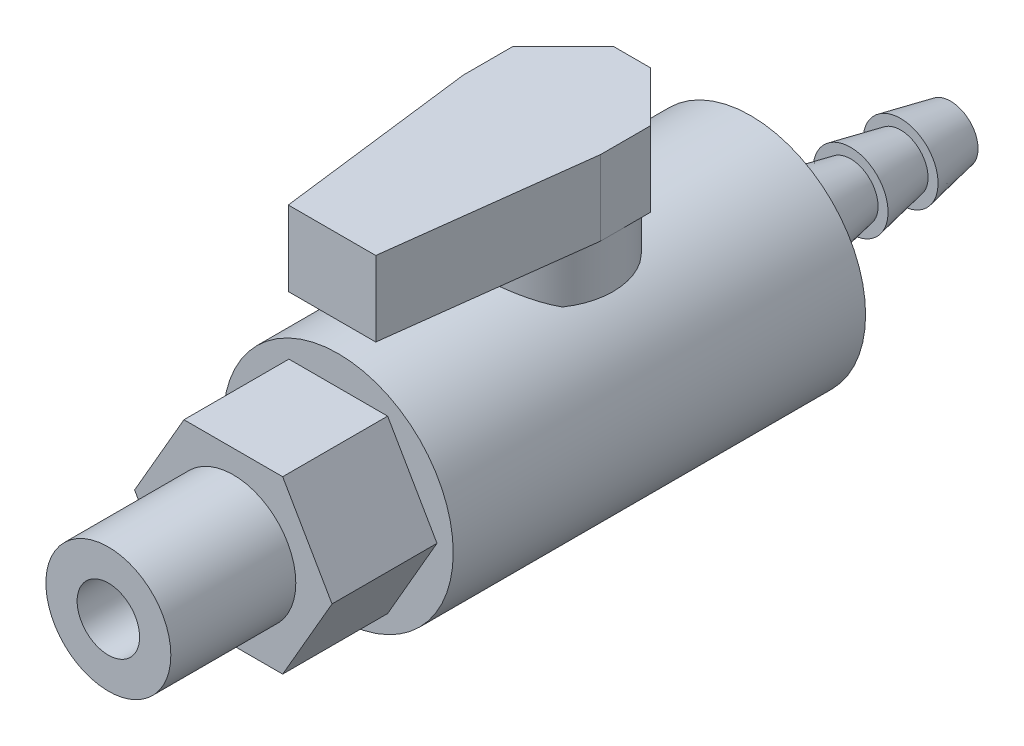
ISO-10303-21;
HEADER;
FILE_DESCRIPTION(('STEP AP214'),'2;1');
FILE_NAME('part.step','',(''),(''),'','','');
FILE_SCHEMA(('AUTOMOTIVE_DESIGN { 1 0 10303 214 1 1 1 1 }'));
ENDSEC;
DATA;
#1=APPLICATION_CONTEXT('core data for automotive mechanical design processes');
#2=APPLICATION_PROTOCOL_DEFINITION('international standard','automotive_design',2000,#1);
#3=PRODUCT_CONTEXT('',#1,'mechanical');
#4=PRODUCT('Part','Part','',(#3));
#5=PRODUCT_RELATED_PRODUCT_CATEGORY('part','',(#4));
#6=PRODUCT_DEFINITION_FORMATION('','',#4);
#7=PRODUCT_DEFINITION_CONTEXT('part definition',#1,'design');
#8=PRODUCT_DEFINITION('design','',#6,#7);
#9=PRODUCT_DEFINITION_SHAPE('','',#8);
#10=(LENGTH_UNIT() NAMED_UNIT(*) SI_UNIT(.MILLI.,.METRE.));
#11=(NAMED_UNIT(*) PLANE_ANGLE_UNIT() SI_UNIT($,.RADIAN.));
#12=(NAMED_UNIT(*) SI_UNIT($,.STERADIAN.) SOLID_ANGLE_UNIT());
#13=UNCERTAINTY_MEASURE_WITH_UNIT(LENGTH_MEASURE(1.E-05),#10,'distance_accuracy_value','');
#14=(GEOMETRIC_REPRESENTATION_CONTEXT(3) GLOBAL_UNCERTAINTY_ASSIGNED_CONTEXT((#13)) GLOBAL_UNIT_ASSIGNED_CONTEXT((#10,
#11,#12)) REPRESENTATION_CONTEXT('',''));
#15=CARTESIAN_POINT('',(0.,0.,0.));
#16=DIRECTION('',(0.,0.,1.));
#17=DIRECTION('',(1.,0.,0.));
#18=AXIS2_PLACEMENT_3D('',#15,#16,#17);
#19=CARTESIAN_POINT('',(0.,0.,0.));
#20=DIRECTION('',(0.,0.,1.));
#21=DIRECTION('',(1.,0.,0.));
#22=AXIS2_PLACEMENT_3D('',#19,#20,#21);
#23=CYLINDRICAL_SURFACE('',#22,11.684);
#24=CARTESIAN_POINT('',(0.,0.,-65.278));
#25=DIRECTION('',(0.,0.,1.));
#26=DIRECTION('',(1.,0.,0.));
#27=AXIS2_PLACEMENT_3D('',#24,#25,#26);
#28=CIRCLE('',#27,11.684);
#29=CARTESIAN_POINT('',(11.684,0.,-65.278));
#30=VERTEX_POINT('',#29);
#31=EDGE_CURVE('E332',#30,#30,#28,.T.);
#32=ORIENTED_EDGE('',*,*,#31,.T.);
#33=EDGE_LOOP('',(#32));
#34=FACE_BOUND('',#33,.T.);
#35=CARTESIAN_POINT('',(0.,0.,-23.368));
#36=DIRECTION('',(0.,0.,1.));
#37=DIRECTION('',(1.,0.,0.));
#38=AXIS2_PLACEMENT_3D('',#35,#36,#37);
#39=CIRCLE('',#38,11.684);
#40=CARTESIAN_POINT('',(11.684,0.,-23.368));
#41=VERTEX_POINT('',#40);
#42=EDGE_CURVE('E328',#41,#41,#39,.T.);
#43=ORIENTED_EDGE('',*,*,#42,.F.);
#44=EDGE_LOOP('',(#43));
#45=FACE_BOUND('',#44,.T.);
#46=CARTESIAN_POINT('',(5.76977087933308,10.16,-40.386));
#47=CARTESIAN_POINT('',(5.65632892103498,10.2244365039873,-40.2197733986789));
#48=CARTESIAN_POINT('',(5.535985553232,10.290253133912,-40.0588133135757));
#49=CARTESIAN_POINT('',(5.2820805201733,10.4228555277688,-39.7480494852985));
#50=CARTESIAN_POINT('',(5.14851635970885,10.4896414726058,-39.5982478574866));
#51=CARTESIAN_POINT('',(4.86795890366655,10.6227636111253,-39.3096247789162));
#52=CARTESIAN_POINT('',(4.72088987833321,10.6890947058936,-39.1708745623798));
#53=CARTESIAN_POINT('',(4.41461789528448,10.8191809507555,-38.9061426237816));
#54=CARTESIAN_POINT('',(4.25541547643622,10.8829362150544,-38.7801603352498));
#55=CARTESIAN_POINT('',(3.92513471056836,11.0063767668538,-38.5415516577204));
#56=CARTESIAN_POINT('',(3.75402777695614,11.0660515237928,-38.4289593092986));
#57=CARTESIAN_POINT('',(3.40114445381335,11.1795533084468,-38.2185236843708));
#58=CARTESIAN_POINT('',(3.21936953363,11.2333811385859,-38.1206783832843));
#59=CARTESIAN_POINT('',(2.84664533285514,11.3335612304382,-37.9410312545628));
#60=CARTESIAN_POINT('',(2.65571954599307,11.3799314307606,-37.8591908230467));
#61=CARTESIAN_POINT('',(2.26564173196638,11.4639655042644,-37.712364516591));
#62=CARTESIAN_POINT('',(2.06649082584244,11.5016305593261,-37.6473763535062));
#63=CARTESIAN_POINT('',(1.67981445420393,11.5641223539297,-37.5403009053585));
#64=CARTESIAN_POINT('',(1.49284988261245,11.5897979641735,-37.4966817016675));
#65=CARTESIAN_POINT('',(1.11497726262205,11.6322316969521,-37.4248825145993));
#66=CARTESIAN_POINT('',(0.924069442431034,11.6489903340458,-37.3967016403421));
#67=CARTESIAN_POINT('',(0.540012813834256,11.6730997779217,-37.3562294705955));
#68=CARTESIAN_POINT('',(0.346864339587791,11.6804519697844,-37.3439358357388));
#69=CARTESIAN_POINT('',(-0.0399059236029485,11.6855318642589,-37.3354369217093));
#70=CARTESIAN_POINT('',(-0.233527670902482,11.6832603852317,-37.3392302745592));
#71=CARTESIAN_POINT('',(-0.597162230984426,11.6699806849551,-37.3614713257114));
#72=CARTESIAN_POINT('',(-0.76732308824445,11.6600100252604,-37.3781789187424));
#73=CARTESIAN_POINT('',(-1.10545241660286,11.6328244074311,-37.423919466847));
#74=CARTESIAN_POINT('',(-1.27342014220378,11.6156070488379,-37.45295650606));
#75=CARTESIAN_POINT('',(-1.60585866269001,11.5743299407636,-37.5229793545471));
#76=CARTESIAN_POINT('',(-1.77033177199984,11.5502748818628,-37.5639569732093));
#77=CARTESIAN_POINT('',(-2.09495476586274,11.4958307325327,-37.6574216172769));
#78=CARTESIAN_POINT('',(-2.25510302437801,11.4654392962229,-37.7099129056975));
#79=CARTESIAN_POINT('',(-2.57282179030345,11.3983874394136,-37.8268518101939));
#80=CARTESIAN_POINT('',(-2.73030288088384,11.361629679152,-37.8914866399702));
#81=CARTESIAN_POINT('',(-3.03909783989209,11.2829599476861,-38.0315060363963));
#82=CARTESIAN_POINT('',(-3.19040912474286,11.2410458462086,-38.1068950480581));
#83=CARTESIAN_POINT('',(-3.63440250504843,11.1086519277036,-38.3484888982689));
#84=CARTESIAN_POINT('',(-3.91700349008683,11.0115512575821,-38.530068241325));
#85=CARTESIAN_POINT('',(-4.33852801805006,10.8499161377072,-38.8453294143044));
#86=CARTESIAN_POINT('',(-4.4879731343829,10.7888178607245,-38.9671287242744));
#87=CARTESIAN_POINT('',(-4.77588910160909,10.6644867904766,-39.2222104101614));
#88=CARTESIAN_POINT('',(-4.91435811103413,10.6012536415694,-39.3554947051261));
#89=CARTESIAN_POINT('',(-5.17937476522111,10.4743241855835,-39.6324797878919));
#90=CARTESIAN_POINT('',(-5.30595198725609,10.4106294762125,-39.7761530695832));
#91=CARTESIAN_POINT('',(-5.54703319730987,10.2842040957948,-40.0736197493284));
#92=CARTESIAN_POINT('',(-5.66154035576268,10.2214731753072,-40.2274104725178));
#93=CARTESIAN_POINT('',(-5.76977087933308,10.16,-40.386));
#94=B_SPLINE_CURVE_WITH_KNOTS('',3,(#46,#47,#48,#49,#50,#51,#52,#53,#54,#55,#56,#57,#58,#59,#60,
#61,#62,#63,#64,#65,#66,#67,#68,#69,#70,#71,#72,#73,#74,#75,#76,#77,#78,#79,#80,#81,#82,#83,#84,
#85,#86,#87,#88,#89,#90,#91,#92,#93),.UNSPECIFIED.,.F.,.F.,(4,2,2,2,2,2,2,2,2,2,2,2,2,2,2,2,2,2,
2,2,2,2,2,4),(0.,0.633729082642627,1.26757800018408,1.90522804188353,2.54284978081293,
3.18205934759029,3.82118107899849,4.45874169713029,5.09621570401146,5.67647366460667,
6.25669813746281,6.83683716357289,7.41692685781365,7.93013108717144,8.44350544864802,
8.95652848785708,9.46974179896653,9.99163566356327,10.5137458702914,11.5584212715623,
12.1646438906745,12.7709680018142,13.3757417590476,13.9803562628952),.UNSPECIFIED.);
#95=CARTESIAN_POINT('',(5.76977087933308,10.16,-40.386));
#96=VERTEX_POINT('',#95);
#97=CARTESIAN_POINT('',(-5.76977087933308,10.16,-40.386));
#98=VERTEX_POINT('',#97);
#99=EDGE_CURVE('E354',#96,#98,#94,.T.);
#100=ORIENTED_EDGE('',*,*,#99,.T.);
#101=DIRECTION('',(0.,0.,1.));
#102=VECTOR('',#101,1.);
#103=CARTESIAN_POINT('',(-5.76977087933308,10.16,0.));
#104=LINE('',#103,#102);
#105=CARTESIAN_POINT('',(-5.76977087933308,10.16,-48.26));
#106=VERTEX_POINT('',#105);
#107=EDGE_CURVE('E457',#98,#106,#104,.F.);
#108=ORIENTED_EDGE('',*,*,#107,.T.);
#109=CARTESIAN_POINT('',(-5.76977087933308,10.16,-48.26));
#110=CARTESIAN_POINT('',(-5.65632892103498,10.2244365039873,-48.4262266013211));
#111=CARTESIAN_POINT('',(-5.53598555323201,10.290253133912,-48.5871866864243));
#112=CARTESIAN_POINT('',(-5.28208052017331,10.4228555277688,-48.8979505147015));
#113=CARTESIAN_POINT('',(-5.14851635970885,10.4896414726058,-49.0477521425134));
#114=CARTESIAN_POINT('',(-4.86795890366655,10.6227636111253,-49.3363752210838));
#115=CARTESIAN_POINT('',(-4.72088987833321,10.6890947058936,-49.4751254376202));
#116=CARTESIAN_POINT('',(-4.41461789528448,10.8191809507555,-49.7398573762185));
#117=CARTESIAN_POINT('',(-4.25541547643622,10.8829362150544,-49.8658396647502));
#118=CARTESIAN_POINT('',(-3.92513471056836,11.0063767668538,-50.1044483422796));
#119=CARTESIAN_POINT('',(-3.75402777695614,11.0660515237928,-50.2170406907014));
#120=CARTESIAN_POINT('',(-3.40114445381335,11.1795533084468,-50.4274763156292));
#121=CARTESIAN_POINT('',(-3.21936953363,11.2333811385859,-50.5253216167157));
#122=CARTESIAN_POINT('',(-2.84664533285514,11.3335612304382,-50.7049687454372));
#123=CARTESIAN_POINT('',(-2.65571954599307,11.3799314307606,-50.7868091769533));
#124=CARTESIAN_POINT('',(-2.26564173196638,11.4639655042644,-50.933635483409));
#125=CARTESIAN_POINT('',(-2.06649082584244,11.5016305593261,-50.9986236464938));
#126=CARTESIAN_POINT('',(-1.67981445420393,11.5641223539297,-51.1056990946415));
#127=CARTESIAN_POINT('',(-1.49284988261245,11.5897979641735,-51.1493182983325));
#128=CARTESIAN_POINT('',(-1.11497726262205,11.6322316969521,-51.2211174854007));
#129=CARTESIAN_POINT('',(-0.924069442431032,11.6489903340458,-51.2492983596579));
#130=CARTESIAN_POINT('',(-0.540012813834255,11.6730997779217,-51.2897705294045));
#131=CARTESIAN_POINT('',(-0.34686433958779,11.6804519697844,-51.3020641642612));
#132=CARTESIAN_POINT('',(0.0399059236029493,11.6855318642589,-51.3105630782907));
#133=CARTESIAN_POINT('',(0.233527670902482,11.6832603852317,-51.3067697254409));
#134=CARTESIAN_POINT('',(0.597162230984427,11.6699806849551,-51.2845286742886));
#135=CARTESIAN_POINT('',(0.76732308824445,11.6600100252604,-51.2678210812576));
#136=CARTESIAN_POINT('',(1.10545241660286,11.6328244074311,-51.222080533153));
#137=CARTESIAN_POINT('',(1.27342014220378,11.6156070488379,-51.19304349394));
#138=CARTESIAN_POINT('',(1.60585866269001,11.5743299407636,-51.1230206454529));
#139=CARTESIAN_POINT('',(1.77033177199984,11.5502748818628,-51.0820430267907));
#140=CARTESIAN_POINT('',(2.09495476586274,11.4958307325327,-50.9885783827231));
#141=CARTESIAN_POINT('',(2.25510302437801,11.4654392962229,-50.9360870943025));
#142=CARTESIAN_POINT('',(2.57282179030345,11.3983874394136,-50.8191481898061));
#143=CARTESIAN_POINT('',(2.73030288088384,11.361629679152,-50.7545133600298));
#144=CARTESIAN_POINT('',(3.03909783989209,11.2829599476861,-50.6144939636037));
#145=CARTESIAN_POINT('',(3.19040912474286,11.2410458462086,-50.5391049519419));
#146=CARTESIAN_POINT('',(3.63440250504843,11.1086519277036,-50.2975111017311));
#147=CARTESIAN_POINT('',(3.91700349008683,11.0115512575821,-50.115931758675));
#148=CARTESIAN_POINT('',(4.33852801805007,10.8499161377072,-49.8006705856956));
#149=CARTESIAN_POINT('',(4.4879731343829,10.7888178607245,-49.6788712757256));
#150=CARTESIAN_POINT('',(4.77588910160909,10.6644867904766,-49.4237895898386));
#151=CARTESIAN_POINT('',(4.91435811103413,10.6012536415694,-49.290505294874));
#152=CARTESIAN_POINT('',(5.17937476522111,10.4743241855835,-49.0135202121081));
#153=CARTESIAN_POINT('',(5.30595198725609,10.4106294762125,-48.8698469304168));
#154=CARTESIAN_POINT('',(5.54703319730987,10.2842040957948,-48.5723802506716));
#155=CARTESIAN_POINT('',(5.66154035576268,10.2214731753072,-48.4185895274822));
#156=CARTESIAN_POINT('',(5.76977087933308,10.16,-48.26));
#157=B_SPLINE_CURVE_WITH_KNOTS('',3,(#109,#110,#111,#112,#113,#114,#115,#116,#117,#118,#119,
#120,#121,#122,#123,#124,#125,#126,#127,#128,#129,#130,#131,#132,#133,#134,#135,#136,#137,#138,
#139,#140,#141,#142,#143,#144,#145,#146,#147,#148,#149,#150,#151,#152,#153,#154,#155,#156),
.UNSPECIFIED.,.F.,.F.,(4,2,2,2,2,2,2,2,2,2,2,2,2,2,2,2,2,2,2,2,2,2,2,4),(0.,0.633729082642625,
1.26757800018408,1.90522804188353,2.54284978081293,3.18205934759029,3.82118107899849,
4.45874169713029,5.09621570401146,5.67647366460667,6.25669813746281,6.83683716357289,
7.41692685781365,7.93013108717144,8.44350544864802,8.95652848785708,9.46974179896653,
9.99163566356327,10.5137458702914,11.5584212715623,12.1646438906745,12.7709680018142,
13.3757417590476,13.9803562628952),.UNSPECIFIED.);
#158=CARTESIAN_POINT('',(5.76977087933308,10.16,-48.26));
#159=VERTEX_POINT('',#158);
#160=EDGE_CURVE('E344',#106,#159,#157,.T.);
#161=ORIENTED_EDGE('',*,*,#160,.T.);
#162=DIRECTION('',(0.,0.,1.));
#163=VECTOR('',#162,1.);
#164=CARTESIAN_POINT('',(5.76977087933308,10.16,0.));
#165=LINE('',#164,#163);
#166=EDGE_CURVE('E340',#159,#96,#165,.T.);
#167=ORIENTED_EDGE('',*,*,#166,.T.);
#168=EDGE_LOOP('',(#100,#108,#161,#167));
#169=FACE_BOUND('',#168,.T.);
#170=ADVANCED_FACE('F45',(#34,#45,#169),#23,.T.);
#171=CARTESIAN_POINT('',(10.16,0.,-12.7));
#172=DIRECTION('',(0.,0.,1.));
#173=DIRECTION('',(1.,0.,0.));
#174=AXIS2_PLACEMENT_3D('',#171,#172,#173);
#175=PLANE('',#174);
#176=CARTESIAN_POINT('',(0.,0.,-12.7));
#177=DIRECTION('',(0.,0.,1.));
#178=DIRECTION('',(1.,0.,0.));
#179=AXIS2_PLACEMENT_3D('',#176,#177,#178);
#180=CIRCLE('',#179,6.35);
#181=CARTESIAN_POINT('',(6.35,0.,-12.7));
#182=VERTEX_POINT('',#181);
#183=EDGE_CURVE('E324',#182,#182,#180,.T.);
#184=ORIENTED_EDGE('',*,*,#183,.F.);
#185=EDGE_LOOP('',(#184));
#186=FACE_BOUND('',#185,.T.);
#187=DIRECTION('',(1.,0.,0.));
#188=VECTOR('',#187,1.);
#189=CARTESIAN_POINT('',(-5.01649999999999,-8.68883287616927,-12.7));
#190=LINE('',#189,#188);
#191=CARTESIAN_POINT('',(-5.01649999999999,-8.68883287616927,-12.7));
#192=VERTEX_POINT('',#191);
#193=CARTESIAN_POINT('',(5.0165,-8.68883287616927,-12.7));
#194=VERTEX_POINT('',#193);
#195=EDGE_CURVE('E194',#192,#194,#190,.T.);
#196=ORIENTED_EDGE('',*,*,#195,.T.);
#197=DIRECTION('',(0.5,0.866025403784439,0.));
#198=VECTOR('',#197,1.);
#199=CARTESIAN_POINT('',(5.0165,-8.68883287616927,-12.7));
#200=LINE('',#199,#198);
#201=CARTESIAN_POINT('',(10.033,0.,-12.7));
#202=VERTEX_POINT('',#201);
#203=EDGE_CURVE('E243',#194,#202,#200,.T.);
#204=ORIENTED_EDGE('',*,*,#203,.T.);
#205=DIRECTION('',(-0.5,0.866025403784439,0.));
#206=VECTOR('',#205,1.);
#207=CARTESIAN_POINT('',(10.033,0.,-12.7));
#208=LINE('',#207,#206);
#209=CARTESIAN_POINT('',(5.0165,8.68883287616927,-12.7));
#210=VERTEX_POINT('',#209);
#211=EDGE_CURVE('E247',#202,#210,#208,.T.);
#212=ORIENTED_EDGE('',*,*,#211,.T.);
#213=DIRECTION('',(-1.,0.,0.));
#214=VECTOR('',#213,1.);
#215=CARTESIAN_POINT('',(5.0165,8.68883287616927,-12.7));
#216=LINE('',#215,#214);
#217=CARTESIAN_POINT('',(-5.01649999999999,8.68883287616927,-12.7));
#218=VERTEX_POINT('',#217);
#219=EDGE_CURVE('E251',#210,#218,#216,.T.);
#220=ORIENTED_EDGE('',*,*,#219,.T.);
#221=DIRECTION('',(-0.5,-0.866025403784439,0.));
#222=VECTOR('',#221,1.);
#223=CARTESIAN_POINT('',(-5.01649999999999,8.68883287616927,-12.7));
#224=LINE('',#223,#222);
#225=CARTESIAN_POINT('',(-10.033,0.,-12.7));
#226=VERTEX_POINT('',#225);
#227=EDGE_CURVE('E255',#218,#226,#224,.T.);
#228=ORIENTED_EDGE('',*,*,#227,.T.);
#229=DIRECTION('',(0.5,-0.866025403784439,0.));
#230=VECTOR('',#229,1.);
#231=CARTESIAN_POINT('',(-10.033,0.,-12.7));
#232=LINE('',#231,#230);
#233=EDGE_CURVE('E259',#226,#192,#232,.T.);
#234=ORIENTED_EDGE('',*,*,#233,.T.);
#235=EDGE_LOOP('',(#196,#204,#212,#220,#228,#234));
#236=FACE_BOUND('',#235,.T.);
#237=ADVANCED_FACE('F433',(#186,#236),#175,.T.);
#238=CARTESIAN_POINT('',(0.,0.,0.));
#239=DIRECTION('',(0.,0.,1.));
#240=DIRECTION('',(1.,0.,0.));
#241=AXIS2_PLACEMENT_3D('',#238,#239,#240);
#242=CYLINDRICAL_SURFACE('',#241,3.81);
#243=CARTESIAN_POINT('',(0.,0.,-65.278));
#244=DIRECTION('',(0.,0.,1.));
#245=DIRECTION('',(1.,0.,0.));
#246=AXIS2_PLACEMENT_3D('',#243,#244,#245);
#247=CIRCLE('',#246,3.81);
#248=CARTESIAN_POINT('',(3.81,0.,-65.278));
#249=VERTEX_POINT('',#248);
#250=EDGE_CURVE('E336',#249,#249,#247,.T.);
#251=ORIENTED_EDGE('',*,*,#250,.F.);
#252=EDGE_LOOP('',(#251));
#253=FACE_BOUND('',#252,.T.);
#254=CARTESIAN_POINT('',(0.,0.,-70.358));
#255=DIRECTION('',(0.,0.,-1.));
#256=DIRECTION('',(-1.,0.,0.));
#257=AXIS2_PLACEMENT_3D('',#254,#255,#256);
#258=CIRCLE('',#257,3.81);
#259=CARTESIAN_POINT('',(-3.81,0.,-70.358));
#260=VERTEX_POINT('',#259);
#261=EDGE_CURVE('E222',#260,#260,#258,.T.);
#262=ORIENTED_EDGE('',*,*,#261,.F.);
#263=EDGE_LOOP('',(#262));
#264=FACE_BOUND('',#263,.T.);
#265=ADVANCED_FACE('F435',(#253,#264),#242,.T.);
#266=CARTESIAN_POINT('',(1.905,0.,-85.598));
#267=DIRECTION('',(0.,0.,-1.));
#268=DIRECTION('',(-1.,0.,0.));
#269=AXIS2_PLACEMENT_3D('',#266,#267,#268);
#270=PLANE('',#269);
#271=CARTESIAN_POINT('',(0.,0.,-85.598));
#272=DIRECTION('',(0.,0.,1.));
#273=DIRECTION('',(1.,0.,0.));
#274=AXIS2_PLACEMENT_3D('',#271,#272,#273);
#275=CIRCLE('',#274,1.905);
#276=CARTESIAN_POINT('',(1.905,0.,-85.598));
#277=VERTEX_POINT('',#276);
#278=EDGE_CURVE('E308',#277,#277,#275,.T.);
#279=ORIENTED_EDGE('',*,*,#278,.T.);
#280=EDGE_LOOP('',(#279));
#281=FACE_BOUND('',#280,.T.);
#282=CARTESIAN_POINT('',(0.,0.,-85.598));
#283=DIRECTION('',(0.,0.,-1.));
#284=DIRECTION('',(-1.,0.,0.));
#285=AXIS2_PLACEMENT_3D('',#282,#283,#284);
#286=CIRCLE('',#285,2.79399999999999);
#287=CARTESIAN_POINT('',(-2.79399999999999,0.,-85.598));
#288=VERTEX_POINT('',#287);
#289=EDGE_CURVE('E304',#288,#288,#286,.T.);
#290=ORIENTED_EDGE('',*,*,#289,.T.);
#291=EDGE_LOOP('',(#290));
#292=FACE_BOUND('',#291,.T.);
#293=ADVANCED_FACE('F443',(#281,#292),#270,.T.);
#294=CARTESIAN_POINT('',(3.81,0.,-65.278));
#295=DIRECTION('',(0.,0.,-1.));
#296=DIRECTION('',(-1.,0.,0.));
#297=AXIS2_PLACEMENT_3D('',#294,#295,#296);
#298=PLANE('',#297);
#299=ORIENTED_EDGE('',*,*,#250,.T.);
#300=EDGE_LOOP('',(#299));
#301=FACE_BOUND('',#300,.T.);
#302=ORIENTED_EDGE('',*,*,#31,.F.);
#303=EDGE_LOOP('',(#302));
#304=FACE_BOUND('',#303,.T.);
#305=ADVANCED_FACE('F438',(#301,#304),#298,.T.);
#306=CARTESIAN_POINT('',(11.684,0.,-23.368));
#307=DIRECTION('',(0.,0.,1.));
#308=DIRECTION('',(1.,0.,0.));
#309=AXIS2_PLACEMENT_3D('',#306,#307,#308);
#310=PLANE('',#309);
#311=ORIENTED_EDGE('',*,*,#42,.T.);
#312=EDGE_LOOP('',(#311));
#313=FACE_BOUND('',#312,.T.);
#314=DIRECTION('',(-0.5,-0.866025403784439,0.));
#315=VECTOR('',#314,1.);
#316=CARTESIAN_POINT('',(5.0165,-8.68883287616927,-23.368));
#317=LINE('',#316,#315);
#318=CARTESIAN_POINT('',(10.033,0.,-23.368));
#319=VERTEX_POINT('',#318);
#320=CARTESIAN_POINT('',(5.0165,-8.68883287616927,-23.368));
#321=VERTEX_POINT('',#320);
#322=EDGE_CURVE('E239',#319,#321,#317,.T.);
#323=ORIENTED_EDGE('',*,*,#322,.T.);
#324=DIRECTION('',(-1.,0.,0.));
#325=VECTOR('',#324,1.);
#326=CARTESIAN_POINT('',(-5.01649999999999,-8.68883287616927,-23.368));
#327=LINE('',#326,#325);
#328=CARTESIAN_POINT('',(-5.01649999999999,-8.68883287616927,-23.368));
#329=VERTEX_POINT('',#328);
#330=EDGE_CURVE('E235',#321,#329,#327,.T.);
#331=ORIENTED_EDGE('',*,*,#330,.T.);
#332=DIRECTION('',(-0.5,0.866025403784439,0.));
#333=VECTOR('',#332,1.);
#334=CARTESIAN_POINT('',(-10.033,0.,-23.368));
#335=LINE('',#334,#333);
#336=CARTESIAN_POINT('',(-10.033,0.,-23.368));
#337=VERTEX_POINT('',#336);
#338=EDGE_CURVE('E231',#329,#337,#335,.T.);
#339=ORIENTED_EDGE('',*,*,#338,.T.);
#340=DIRECTION('',(0.5,0.866025403784439,0.));
#341=VECTOR('',#340,1.);
#342=CARTESIAN_POINT('',(-5.01649999999999,8.68883287616927,-23.368));
#343=LINE('',#342,#341);
#344=CARTESIAN_POINT('',(-5.0165,8.68883287616927,-23.368));
#345=VERTEX_POINT('',#344);
#346=EDGE_CURVE('E227',#337,#345,#343,.T.);
#347=ORIENTED_EDGE('',*,*,#346,.T.);
#348=DIRECTION('',(1.,0.,0.));
#349=VECTOR('',#348,1.);
#350=CARTESIAN_POINT('',(5.0165,8.68883287616927,-23.368));
#351=LINE('',#350,#349);
#352=CARTESIAN_POINT('',(5.0165,8.68883287616927,-23.368));
#353=VERTEX_POINT('',#352);
#354=EDGE_CURVE('E223',#345,#353,#351,.T.);
#355=ORIENTED_EDGE('',*,*,#354,.T.);
#356=DIRECTION('',(0.5,-0.866025403784439,0.));
#357=VECTOR('',#356,1.);
#358=CARTESIAN_POINT('',(10.033,0.,-23.368));
#359=LINE('',#358,#357);
#360=EDGE_CURVE('E218',#353,#319,#359,.T.);
#361=ORIENTED_EDGE('',*,*,#360,.T.);
#362=EDGE_LOOP('',(#323,#331,#339,#347,#355,#361));
#363=FACE_BOUND('',#362,.T.);
#364=ADVANCED_FACE('F431',(#313,#363),#310,.T.);
#365=CARTESIAN_POINT('',(0.,0.,0.));
#366=DIRECTION('',(0.,0.,1.));
#367=DIRECTION('',(1.,0.,0.));
#368=AXIS2_PLACEMENT_3D('',#365,#366,#367);
#369=CYLINDRICAL_SURFACE('',#368,6.35);
#370=ORIENTED_EDGE('',*,*,#183,.T.);
#371=EDGE_LOOP('',(#370));
#372=FACE_BOUND('',#371,.T.);
#373=CARTESIAN_POINT('',(0.,0.,0.));
#374=DIRECTION('',(0.,0.,1.));
#375=DIRECTION('',(1.,0.,0.));
#376=AXIS2_PLACEMENT_3D('',#373,#374,#375);
#377=CIRCLE('',#376,6.35);
#378=CARTESIAN_POINT('',(6.35,0.,0.));
#379=VERTEX_POINT('',#378);
#380=EDGE_CURVE('E320',#379,#379,#377,.T.);
#381=ORIENTED_EDGE('',*,*,#380,.F.);
#382=EDGE_LOOP('',(#381));
#383=FACE_BOUND('',#382,.T.);
#384=ADVANCED_FACE('F427',(#372,#383),#369,.T.);
#385=CARTESIAN_POINT('',(6.35,0.,0.));
#386=DIRECTION('',(0.,0.,1.));
#387=DIRECTION('',(1.,0.,0.));
#388=AXIS2_PLACEMENT_3D('',#385,#386,#387);
#389=PLANE('',#388);
#390=ORIENTED_EDGE('',*,*,#380,.T.);
#391=EDGE_LOOP('',(#390));
#392=FACE_BOUND('',#391,.T.);
#393=CARTESIAN_POINT('',(0.,0.,0.));
#394=DIRECTION('',(0.,0.,1.));
#395=DIRECTION('',(1.,0.,0.));
#396=AXIS2_PLACEMENT_3D('',#393,#394,#395);
#397=CIRCLE('',#396,3.175);
#398=CARTESIAN_POINT('',(3.175,0.,0.));
#399=VERTEX_POINT('',#398);
#400=EDGE_CURVE('E316',#399,#399,#397,.T.);
#401=ORIENTED_EDGE('',*,*,#400,.F.);
#402=EDGE_LOOP('',(#401));
#403=FACE_BOUND('',#402,.T.);
#404=ADVANCED_FACE('F423',(#392,#403),#389,.T.);
#405=CARTESIAN_POINT('',(0.,0.,0.));
#406=DIRECTION('',(0.,0.,1.));
#407=DIRECTION('',(1.,0.,0.));
#408=AXIS2_PLACEMENT_3D('',#405,#406,#407);
#409=CYLINDRICAL_SURFACE('',#408,3.175);
#410=ORIENTED_EDGE('',*,*,#400,.T.);
#411=EDGE_LOOP('',(#410));
#412=FACE_BOUND('',#411,.T.);
#413=CARTESIAN_POINT('',(0.,0.,-65.278));
#414=DIRECTION('',(0.,0.,1.));
#415=DIRECTION('',(1.,0.,0.));
#416=AXIS2_PLACEMENT_3D('',#413,#414,#415);
#417=CIRCLE('',#416,3.175);
#418=CARTESIAN_POINT('',(3.175,0.,-65.278));
#419=VERTEX_POINT('',#418);
#420=EDGE_CURVE('E312',#419,#419,#417,.T.);
#421=ORIENTED_EDGE('',*,*,#420,.F.);
#422=EDGE_LOOP('',(#421));
#423=FACE_BOUND('',#422,.T.);
#424=ADVANCED_FACE('F419',(#412,#423),#409,.F.);
#425=CARTESIAN_POINT('',(0.,0.,-85.598));
#426=DIRECTION('',(0.,0.,1.));
#427=DIRECTION('',(1.,0.,0.));
#428=AXIS2_PLACEMENT_3D('',#425,#426,#427);
#429=CONICAL_SURFACE('',#428,1.905,0.0624188099959573);
#430=ORIENTED_EDGE('',*,*,#420,.T.);
#431=EDGE_LOOP('',(#430));
#432=FACE_BOUND('',#431,.T.);
#433=ORIENTED_EDGE('',*,*,#278,.F.);
#434=EDGE_LOOP('',(#433));
#435=FACE_BOUND('',#434,.T.);
#436=ADVANCED_FACE('F415',(#432,#435),#429,.F.);
#437=CARTESIAN_POINT('',(0.,0.,-85.598));
#438=DIRECTION('',(0.,0.,1.));
#439=DIRECTION('',(1.,0.,0.));
#440=AXIS2_PLACEMENT_3D('',#437,#438,#439);
#441=CONICAL_SURFACE('',#440,2.79399999999999,0.197395559849883);
#442=CARTESIAN_POINT('',(0.,0.,-80.518));
#443=DIRECTION('',(0.,0.,-1.));
#444=DIRECTION('',(-1.,0.,0.));
#445=AXIS2_PLACEMENT_3D('',#442,#443,#444);
#446=CIRCLE('',#445,3.81);
#447=CARTESIAN_POINT('',(-3.81,0.,-80.518));
#448=VERTEX_POINT('',#447);
#449=EDGE_CURVE('E300',#448,#448,#446,.T.);
#450=ORIENTED_EDGE('',*,*,#449,.T.);
#451=EDGE_LOOP('',(#450));
#452=FACE_BOUND('',#451,.T.);
#453=ORIENTED_EDGE('',*,*,#289,.F.);
#454=EDGE_LOOP('',(#453));
#455=FACE_BOUND('',#454,.T.);
#456=ADVANCED_FACE('F411',(#452,#455),#441,.T.);
#457=CARTESIAN_POINT('',(3.81,0.,-80.518));
#458=DIRECTION('',(0.,0.,1.));
#459=DIRECTION('',(1.,0.,0.));
#460=AXIS2_PLACEMENT_3D('',#457,#458,#459);
#461=PLANE('',#460);
#462=CARTESIAN_POINT('',(0.,0.,-80.518));
#463=DIRECTION('',(0.,0.,-1.));
#464=DIRECTION('',(-1.,0.,0.));
#465=AXIS2_PLACEMENT_3D('',#462,#463,#464);
#466=CIRCLE('',#465,2.79399999999999);
#467=CARTESIAN_POINT('',(-2.79399999999999,0.,-80.518));
#468=VERTEX_POINT('',#467);
#469=EDGE_CURVE('E296',#468,#468,#466,.T.);
#470=ORIENTED_EDGE('',*,*,#469,.T.);
#471=EDGE_LOOP('',(#470));
#472=FACE_BOUND('',#471,.T.);
#473=ORIENTED_EDGE('',*,*,#449,.F.);
#474=EDGE_LOOP('',(#473));
#475=FACE_BOUND('',#474,.T.);
#476=ADVANCED_FACE('F407',(#472,#475),#461,.T.);
#477=CARTESIAN_POINT('',(0.,0.,-80.518));
#478=DIRECTION('',(0.,0.,1.));
#479=DIRECTION('',(1.,0.,0.));
#480=AXIS2_PLACEMENT_3D('',#477,#478,#479);
#481=CONICAL_SURFACE('',#480,2.79399999999999,0.197395559849883);
#482=CARTESIAN_POINT('',(0.,0.,-75.438));
#483=DIRECTION('',(0.,0.,-1.));
#484=DIRECTION('',(-1.,0.,0.));
#485=AXIS2_PLACEMENT_3D('',#482,#483,#484);
#486=CIRCLE('',#485,3.81);
#487=CARTESIAN_POINT('',(-3.81,0.,-75.438));
#488=VERTEX_POINT('',#487);
#489=EDGE_CURVE('E292',#488,#488,#486,.T.);
#490=ORIENTED_EDGE('',*,*,#489,.T.);
#491=EDGE_LOOP('',(#490));
#492=FACE_BOUND('',#491,.T.);
#493=ORIENTED_EDGE('',*,*,#469,.F.);
#494=EDGE_LOOP('',(#493));
#495=FACE_BOUND('',#494,.T.);
#496=ADVANCED_FACE('F403',(#492,#495),#481,.T.);
#497=CARTESIAN_POINT('',(3.81,0.,-75.438));
#498=DIRECTION('',(0.,0.,1.));
#499=DIRECTION('',(1.,0.,0.));
#500=AXIS2_PLACEMENT_3D('',#497,#498,#499);
#501=PLANE('',#500);
#502=CARTESIAN_POINT('',(0.,0.,-75.438));
#503=DIRECTION('',(0.,0.,-1.));
#504=DIRECTION('',(-1.,0.,0.));
#505=AXIS2_PLACEMENT_3D('',#502,#503,#504);
#506=CIRCLE('',#505,2.79399999999999);
#507=CARTESIAN_POINT('',(-2.79399999999999,0.,-75.438));
#508=VERTEX_POINT('',#507);
#509=EDGE_CURVE('E288',#508,#508,#506,.T.);
#510=ORIENTED_EDGE('',*,*,#509,.T.);
#511=EDGE_LOOP('',(#510));
#512=FACE_BOUND('',#511,.T.);
#513=ORIENTED_EDGE('',*,*,#489,.F.);
#514=EDGE_LOOP('',(#513));
#515=FACE_BOUND('',#514,.T.);
#516=ADVANCED_FACE('F399',(#512,#515),#501,.T.);
#517=CARTESIAN_POINT('',(0.,0.,-75.438));
#518=DIRECTION('',(0.,0.,1.));
#519=DIRECTION('',(1.,0.,0.));
#520=AXIS2_PLACEMENT_3D('',#517,#518,#519);
#521=CONICAL_SURFACE('',#520,2.79399999999999,0.197395559849883);
#522=ORIENTED_EDGE('',*,*,#261,.T.);
#523=EDGE_LOOP('',(#522));
#524=FACE_BOUND('',#523,.T.);
#525=ORIENTED_EDGE('',*,*,#509,.F.);
#526=EDGE_LOOP('',(#525));
#527=FACE_BOUND('',#526,.T.);
#528=ADVANCED_FACE('F392',(#524,#527),#521,.T.);
#529=CARTESIAN_POINT('',(5.0165,-8.68883287616927,-52.1048195874213));
#530=DIRECTION('',(0.866025403784439,-0.5,0.));
#531=DIRECTION('',(0.5,0.866025403784439,0.));
#532=AXIS2_PLACEMENT_3D('',#529,#530,#531);
#533=PLANE('',#532);
#534=DIRECTION('',(0.,0.,1.));
#535=VECTOR('',#534,1.);
#536=CARTESIAN_POINT('',(10.033,0.,-52.1048195874213));
#537=LINE('',#536,#535);
#538=EDGE_CURVE('E276',#319,#202,#537,.T.);
#539=ORIENTED_EDGE('',*,*,#538,.T.);
#540=ORIENTED_EDGE('',*,*,#203,.F.);
#541=DIRECTION('',(0.,0.,1.));
#542=VECTOR('',#541,1.);
#543=CARTESIAN_POINT('',(5.0165,-8.68883287616927,-52.1048195874213));
#544=LINE('',#543,#542);
#545=EDGE_CURVE('E263',#321,#194,#544,.T.);
#546=ORIENTED_EDGE('',*,*,#545,.F.);
#547=ORIENTED_EDGE('',*,*,#322,.F.);
#548=EDGE_LOOP('',(#539,#540,#546,#547));
#549=FACE_BOUND('',#548,.T.);
#550=ADVANCED_FACE('F388',(#549),#533,.T.);
#551=CARTESIAN_POINT('',(10.033,0.,-52.1048195874213));
#552=DIRECTION('',(0.866025403784438,0.5,0.));
#553=DIRECTION('',(-0.5,0.866025403784439,0.));
#554=AXIS2_PLACEMENT_3D('',#551,#552,#553);
#555=PLANE('',#554);
#556=DIRECTION('',(0.,0.,1.));
#557=VECTOR('',#556,1.);
#558=CARTESIAN_POINT('',(5.0165,8.68883287616927,-52.1048195874213));
#559=LINE('',#558,#557);
#560=EDGE_CURVE('E273',#353,#210,#559,.T.);
#561=ORIENTED_EDGE('',*,*,#560,.T.);
#562=ORIENTED_EDGE('',*,*,#211,.F.);
#563=ORIENTED_EDGE('',*,*,#538,.F.);
#564=ORIENTED_EDGE('',*,*,#360,.F.);
#565=EDGE_LOOP('',(#561,#562,#563,#564));
#566=FACE_BOUND('',#565,.T.);
#567=ADVANCED_FACE('F384',(#566),#555,.T.);
#568=CARTESIAN_POINT('',(5.0165,8.68883287616927,-52.1048195874213));
#569=DIRECTION('',(0.,1.,0.));
#570=DIRECTION('',(-1.,0.,0.));
#571=AXIS2_PLACEMENT_3D('',#568,#569,#570);
#572=PLANE('',#571);
#573=DIRECTION('',(0.,0.,1.));
#574=VECTOR('',#573,1.);
#575=CARTESIAN_POINT('',(-5.01649999999999,8.68883287616927,-52.1048195874213));
#576=LINE('',#575,#574);
#577=EDGE_CURVE('E270',#345,#218,#576,.T.);
#578=ORIENTED_EDGE('',*,*,#577,.T.);
#579=ORIENTED_EDGE('',*,*,#219,.F.);
#580=ORIENTED_EDGE('',*,*,#560,.F.);
#581=ORIENTED_EDGE('',*,*,#354,.F.);
#582=EDGE_LOOP('',(#578,#579,#580,#581));
#583=FACE_BOUND('',#582,.T.);
#584=ADVANCED_FACE('F380',(#583),#572,.T.);
#585=CARTESIAN_POINT('',(-5.01649999999999,8.68883287616927,-52.1048195874213));
#586=DIRECTION('',(-0.866025403784438,0.5,0.));
#587=DIRECTION('',(-0.5,-0.866025403784439,0.));
#588=AXIS2_PLACEMENT_3D('',#585,#586,#587);
#589=PLANE('',#588);
#590=DIRECTION('',(0.,0.,1.));
#591=VECTOR('',#590,1.);
#592=CARTESIAN_POINT('',(-10.033,0.,-52.1048195874213));
#593=LINE('',#592,#591);
#594=EDGE_CURVE('E267',#337,#226,#593,.T.);
#595=ORIENTED_EDGE('',*,*,#594,.T.);
#596=ORIENTED_EDGE('',*,*,#227,.F.);
#597=ORIENTED_EDGE('',*,*,#577,.F.);
#598=ORIENTED_EDGE('',*,*,#346,.F.);
#599=EDGE_LOOP('',(#595,#596,#597,#598));
#600=FACE_BOUND('',#599,.T.);
#601=ADVANCED_FACE('F376',(#600),#589,.T.);
#602=CARTESIAN_POINT('',(-10.033,0.,-52.1048195874213));
#603=DIRECTION('',(-0.866025403784438,-0.5,0.));
#604=DIRECTION('',(0.5,-0.866025403784439,0.));
#605=AXIS2_PLACEMENT_3D('',#602,#603,#604);
#606=PLANE('',#605);
#607=DIRECTION('',(0.,0.,1.));
#608=VECTOR('',#607,1.);
#609=CARTESIAN_POINT('',(-5.01649999999999,-8.68883287616927,-52.1048195874213));
#610=LINE('',#609,#608);
#611=EDGE_CURVE('E264',#329,#192,#610,.T.);
#612=ORIENTED_EDGE('',*,*,#611,.T.);
#613=ORIENTED_EDGE('',*,*,#233,.F.);
#614=ORIENTED_EDGE('',*,*,#594,.F.);
#615=ORIENTED_EDGE('',*,*,#338,.F.);
#616=EDGE_LOOP('',(#612,#613,#614,#615));
#617=FACE_BOUND('',#616,.T.);
#618=ADVANCED_FACE('F371',(#617),#606,.T.);
#619=CARTESIAN_POINT('',(-5.01649999999999,-8.68883287616927,-52.1048195874213));
#620=DIRECTION('',(0.,-1.,0.));
#621=DIRECTION('',(1.,0.,0.));
#622=AXIS2_PLACEMENT_3D('',#619,#620,#621);
#623=PLANE('',#622);
#624=ORIENTED_EDGE('',*,*,#545,.T.);
#625=ORIENTED_EDGE('',*,*,#195,.F.);
#626=ORIENTED_EDGE('',*,*,#611,.F.);
#627=ORIENTED_EDGE('',*,*,#330,.F.);
#628=EDGE_LOOP('',(#624,#625,#626,#627));
#629=FACE_BOUND('',#628,.T.);
#630=ADVANCED_FACE('F375',(#629),#623,.T.);
#631=CARTESIAN_POINT('',(0.,10.16,-44.323));
#632=DIRECTION('',(0.,1.,0.));
#633=DIRECTION('',(0.,0.,1.));
#634=AXIS2_PLACEMENT_3D('',#631,#632,#633);
#635=PLANE('',#634);
#636=ORIENTED_EDGE('',*,*,#107,.F.);
#637=CARTESIAN_POINT('',(0.,10.16,-44.323));
#638=DIRECTION('',(0.,1.,0.));
#639=DIRECTION('',(0.,0.,1.));
#640=AXIS2_PLACEMENT_3D('',#637,#638,#639);
#641=CIRCLE('',#640,6.985);
#642=EDGE_CURVE('E217',#106,#98,#641,.T.);
#643=ORIENTED_EDGE('',*,*,#642,.F.);
#644=EDGE_LOOP('',(#636,#643));
#645=FACE_BOUND('',#644,.T.);
#646=ADVANCED_FACE('F368',(#645),#635,.F.);
#647=CARTESIAN_POINT('',(0.,15.24,-44.323));
#648=DIRECTION('',(0.,-1.,0.));
#649=DIRECTION('',(0.,0.,-1.));
#650=AXIS2_PLACEMENT_3D('',#647,#648,#649);
#651=CYLINDRICAL_SURFACE('',#650,6.985);
#652=ORIENTED_EDGE('',*,*,#99,.F.);
#653=EDGE_CURVE('E199',#96,#159,#641,.T.);
#654=ORIENTED_EDGE('',*,*,#653,.T.);
#655=ORIENTED_EDGE('',*,*,#160,.F.);
#656=ORIENTED_EDGE('',*,*,#642,.T.);
#657=EDGE_LOOP('',(#652,#654,#655,#656));
#658=FACE_BOUND('',#657,.T.);
#659=CARTESIAN_POINT('',(0.,15.24,-44.323));
#660=DIRECTION('',(0.,1.,0.));
#661=DIRECTION('',(0.,0.,1.));
#662=AXIS2_PLACEMENT_3D('',#659,#660,#661);
#663=CIRCLE('',#662,6.985);
#664=CARTESIAN_POINT('',(6.985,15.24,-44.323));
#665=VERTEX_POINT('',#664);
#666=CARTESIAN_POINT('',(-6.985,15.24,-44.323));
#667=VERTEX_POINT('',#666);
#668=EDGE_CURVE('E187',#665,#667,#663,.T.);
#669=ORIENTED_EDGE('',*,*,#668,.F.);
#670=EDGE_CURVE('E189',#667,#665,#663,.T.);
#671=ORIENTED_EDGE('',*,*,#670,.F.);
#672=EDGE_LOOP('',(#669,#671));
#673=FACE_BOUND('',#672,.T.);
#674=ADVANCED_FACE('F188',(#658,#673),#651,.T.);
#675=ORIENTED_EDGE('',*,*,#166,.F.);
#676=ORIENTED_EDGE('',*,*,#653,.F.);
#677=EDGE_LOOP('',(#675,#676));
#678=FACE_BOUND('',#677,.T.);
#679=ADVANCED_FACE('F367',(#678),#635,.F.);
#680=CARTESIAN_POINT('',(0.,15.24,0.));
#681=DIRECTION('',(0.,1.,0.));
#682=DIRECTION('',(0.,0.,1.));
#683=AXIS2_PLACEMENT_3D('',#680,#681,#682);
#684=PLANE('',#683);
#685=DIRECTION('',(0.,0.,1.));
#686=VECTOR('',#685,1.);
#687=CARTESIAN_POINT('',(-6.985,15.24,-53.213));
#688=LINE('',#687,#686);
#689=CARTESIAN_POINT('',(-6.985,15.24,-48.133));
#690=VERTEX_POINT('',#689);
#691=EDGE_CURVE('E206',#690,#667,#688,.T.);
#692=ORIENTED_EDGE('',*,*,#691,.F.);
#693=DIRECTION('',(-0.707106781186548,0.,0.707106781186547));
#694=VECTOR('',#693,1.);
#695=CARTESIAN_POINT('',(-6.985,15.24,-48.133));
#696=LINE('',#695,#694);
#697=CARTESIAN_POINT('',(-1.90499999999999,15.24,-53.213));
#698=VERTEX_POINT('',#697);
#699=EDGE_CURVE('E468',#690,#698,#696,.F.);
#700=ORIENTED_EDGE('',*,*,#699,.T.);
#701=DIRECTION('',(-1.,0.,0.));
#702=VECTOR('',#701,1.);
#703=CARTESIAN_POINT('',(-6.985,15.24,-53.213));
#704=LINE('',#703,#702);
#705=CARTESIAN_POINT('',(1.90499999999996,15.24,-53.213));
#706=VERTEX_POINT('',#705);
#707=EDGE_CURVE('E182',#706,#698,#704,.T.);
#708=ORIENTED_EDGE('',*,*,#707,.F.);
#709=DIRECTION('',(-0.707106781186547,0.,-0.707106781186548));
#710=VECTOR('',#709,1.);
#711=CARTESIAN_POINT('',(1.90499999999996,15.24,-53.213));
#712=LINE('',#711,#710);
#713=CARTESIAN_POINT('',(6.985,15.24,-48.133));
#714=VERTEX_POINT('',#713);
#715=EDGE_CURVE('E202',#706,#714,#712,.F.);
#716=ORIENTED_EDGE('',*,*,#715,.T.);
#717=DIRECTION('',(0.,0.,-1.));
#718=VECTOR('',#717,1.);
#719=CARTESIAN_POINT('',(6.985,15.24,-53.213));
#720=LINE('',#719,#718);
#721=EDGE_CURVE('E175',#665,#714,#720,.T.);
#722=ORIENTED_EDGE('',*,*,#721,.F.);
#723=ORIENTED_EDGE('',*,*,#668,.T.);
#724=EDGE_LOOP('',(#692,#700,#708,#716,#722,#723));
#725=FACE_BOUND('',#724,.T.);
#726=ADVANCED_FACE('F200',(#725),#684,.F.);
#727=CARTESIAN_POINT('',(6.985,15.24,-43.053));
#728=VERTEX_POINT('',#727);
#729=EDGE_CURVE('E169',#728,#665,#720,.T.);
#730=ORIENTED_EDGE('',*,*,#729,.F.);
#731=DIRECTION('',(0.124034734589215,0.,-0.992277876713667));
#732=VECTOR('',#731,1.);
#733=CARTESIAN_POINT('',(6.985,15.24,-43.053));
#734=LINE('',#733,#732);
#735=CARTESIAN_POINT('',(4.44499999999985,15.24,-22.733));
#736=VERTEX_POINT('',#735);
#737=EDGE_CURVE('E492',#728,#736,#734,.F.);
#738=ORIENTED_EDGE('',*,*,#737,.T.);
#739=DIRECTION('',(1.,0.,0.));
#740=VECTOR('',#739,1.);
#741=CARTESIAN_POINT('',(-6.985,15.24,-22.733));
#742=LINE('',#741,#740);
#743=CARTESIAN_POINT('',(-4.445,15.24,-22.733));
#744=VERTEX_POINT('',#743);
#745=EDGE_CURVE('E204',#744,#736,#742,.T.);
#746=ORIENTED_EDGE('',*,*,#745,.F.);
#747=DIRECTION('',(0.124034734589205,0.,0.992277876713668));
#748=VECTOR('',#747,1.);
#749=CARTESIAN_POINT('',(-4.445,15.24,-22.733));
#750=LINE('',#749,#748);
#751=CARTESIAN_POINT('',(-6.985,15.24,-43.0530000000006));
#752=VERTEX_POINT('',#751);
#753=EDGE_CURVE('E489',#744,#752,#750,.F.);
#754=ORIENTED_EDGE('',*,*,#753,.T.);
#755=EDGE_CURVE('E197',#667,#752,#688,.T.);
#756=ORIENTED_EDGE('',*,*,#755,.F.);
#757=ORIENTED_EDGE('',*,*,#670,.T.);
#758=EDGE_LOOP('',(#730,#738,#746,#754,#756,#757));
#759=FACE_BOUND('',#758,.T.);
#760=ADVANCED_FACE('F196',(#759),#684,.F.);
#761=CARTESIAN_POINT('',(-6.985,22.86,-53.213));
#762=DIRECTION('',(1.,0.,0.));
#763=DIRECTION('',(0.,0.,-1.));
#764=AXIS2_PLACEMENT_3D('',#761,#762,#763);
#765=PLANE('',#764);
#766=ORIENTED_EDGE('',*,*,#755,.T.);
#767=DIRECTION('',(0.,1.,0.));
#768=VECTOR('',#767,1.);
#769=CARTESIAN_POINT('',(-6.985,22.86,-43.0530000000006));
#770=LINE('',#769,#768);
#771=CARTESIAN_POINT('',(-6.985,22.86,-43.0530000000006));
#772=VERTEX_POINT('',#771);
#773=EDGE_CURVE('E11',#752,#772,#770,.T.);
#774=ORIENTED_EDGE('',*,*,#773,.T.);
#775=DIRECTION('',(0.,0.,1.));
#776=VECTOR('',#775,1.);
#777=CARTESIAN_POINT('',(-6.985,22.86,-53.213));
#778=LINE('',#777,#776);
#779=CARTESIAN_POINT('',(-6.985,22.86,-48.133));
#780=VERTEX_POINT('',#779);
#781=EDGE_CURVE('E212',#780,#772,#778,.T.);
#782=ORIENTED_EDGE('',*,*,#781,.F.);
#783=DIRECTION('',(0.,-1.,0.));
#784=VECTOR('',#783,1.);
#785=CARTESIAN_POINT('',(-6.985,22.86,-48.133));
#786=LINE('',#785,#784);
#787=EDGE_CURVE('E461',#780,#690,#786,.T.);
#788=ORIENTED_EDGE('',*,*,#787,.T.);
#789=ORIENTED_EDGE('',*,*,#691,.T.);
#790=EDGE_LOOP('',(#766,#774,#782,#788,#789));
#791=FACE_BOUND('',#790,.T.);
#792=ADVANCED_FACE('F520',(#791),#765,.F.);
#793=CARTESIAN_POINT('',(-6.985,22.86,-22.733));
#794=DIRECTION('',(0.,0.,-1.));
#795=DIRECTION('',(-1.,0.,0.));
#796=AXIS2_PLACEMENT_3D('',#793,#794,#795);
#797=PLANE('',#796);
#798=ORIENTED_EDGE('',*,*,#745,.T.);
#799=DIRECTION('',(0.,1.,0.));
#800=VECTOR('',#799,1.);
#801=CARTESIAN_POINT('',(4.44499999999986,22.86,-22.733));
#802=LINE('',#801,#800);
#803=CARTESIAN_POINT('',(4.44499999999985,22.86,-22.733));
#804=VERTEX_POINT('',#803);
#805=EDGE_CURVE('E68',#736,#804,#802,.T.);
#806=ORIENTED_EDGE('',*,*,#805,.T.);
#807=DIRECTION('',(1.,0.,0.));
#808=VECTOR('',#807,1.);
#809=CARTESIAN_POINT('',(-6.985,22.86,-22.733));
#810=LINE('',#809,#808);
#811=CARTESIAN_POINT('',(-4.445,22.86,-22.733));
#812=VERTEX_POINT('',#811);
#813=EDGE_CURVE('E508',#812,#804,#810,.T.);
#814=ORIENTED_EDGE('',*,*,#813,.F.);
#815=DIRECTION('',(0.,-1.,0.));
#816=VECTOR('',#815,1.);
#817=CARTESIAN_POINT('',(-4.445,22.86,-22.733));
#818=LINE('',#817,#816);
#819=EDGE_CURVE('E495',#812,#744,#818,.T.);
#820=ORIENTED_EDGE('',*,*,#819,.T.);
#821=EDGE_LOOP('',(#798,#806,#814,#820));
#822=FACE_BOUND('',#821,.T.);
#823=ADVANCED_FACE('F516',(#822),#797,.F.);
#824=CARTESIAN_POINT('',(6.985,22.86,-53.213));
#825=DIRECTION('',(-1.,0.,0.));
#826=DIRECTION('',(0.,0.,1.));
#827=AXIS2_PLACEMENT_3D('',#824,#825,#826);
#828=PLANE('',#827);
#829=DIRECTION('',(0.,0.,-1.));
#830=VECTOR('',#829,1.);
#831=CARTESIAN_POINT('',(6.985,22.86,-53.213));
#832=LINE('',#831,#830);
#833=CARTESIAN_POINT('',(6.985,22.86,-43.053));
#834=VERTEX_POINT('',#833);
#835=CARTESIAN_POINT('',(6.985,22.86,-48.133));
#836=VERTEX_POINT('',#835);
#837=EDGE_CURVE('E507',#834,#836,#832,.T.);
#838=ORIENTED_EDGE('',*,*,#837,.F.);
#839=DIRECTION('',(0.,-1.,0.));
#840=VECTOR('',#839,1.);
#841=CARTESIAN_POINT('',(6.985,22.86,-43.053));
#842=LINE('',#841,#840);
#843=EDGE_CURVE('E178',#834,#728,#842,.T.);
#844=ORIENTED_EDGE('',*,*,#843,.T.);
#845=ORIENTED_EDGE('',*,*,#729,.T.);
#846=ORIENTED_EDGE('',*,*,#721,.T.);
#847=DIRECTION('',(0.,1.,0.));
#848=VECTOR('',#847,1.);
#849=CARTESIAN_POINT('',(6.985,22.86,-48.133));
#850=LINE('',#849,#848);
#851=EDGE_CURVE('E484',#714,#836,#850,.T.);
#852=ORIENTED_EDGE('',*,*,#851,.T.);
#853=EDGE_LOOP('',(#838,#844,#845,#846,#852));
#854=FACE_BOUND('',#853,.T.);
#855=ADVANCED_FACE('F172',(#854),#828,.F.);
#856=CARTESIAN_POINT('',(-6.985,22.86,-53.213));
#857=DIRECTION('',(0.,0.,1.));
#858=DIRECTION('',(1.,0.,0.));
#859=AXIS2_PLACEMENT_3D('',#856,#857,#858);
#860=PLANE('',#859);
#861=ORIENTED_EDGE('',*,*,#707,.T.);
#862=DIRECTION('',(0.,1.,0.));
#863=VECTOR('',#862,1.);
#864=CARTESIAN_POINT('',(-1.90499999999999,22.86,-53.213));
#865=LINE('',#864,#863);
#866=CARTESIAN_POINT('',(-1.90499999999999,22.86,-53.213));
#867=VERTEX_POINT('',#866);
#868=EDGE_CURVE('E475',#698,#867,#865,.T.);
#869=ORIENTED_EDGE('',*,*,#868,.T.);
#870=DIRECTION('',(-1.,0.,0.));
#871=VECTOR('',#870,1.);
#872=CARTESIAN_POINT('',(-6.985,22.86,-53.213));
#873=LINE('',#872,#871);
#874=CARTESIAN_POINT('',(1.90499999999996,22.86,-53.213));
#875=VERTEX_POINT('',#874);
#876=EDGE_CURVE('E512',#875,#867,#873,.T.);
#877=ORIENTED_EDGE('',*,*,#876,.F.);
#878=DIRECTION('',(0.,-1.,0.));
#879=VECTOR('',#878,1.);
#880=CARTESIAN_POINT('',(1.90499999999996,22.86,-53.213));
#881=LINE('',#880,#879);
#882=EDGE_CURVE('E471',#875,#706,#881,.T.);
#883=ORIENTED_EDGE('',*,*,#882,.T.);
#884=EDGE_LOOP('',(#861,#869,#877,#883));
#885=FACE_BOUND('',#884,.T.);
#886=ADVANCED_FACE('F536',(#885),#860,.F.);
#887=CARTESIAN_POINT('',(0.,22.86,0.));
#888=DIRECTION('',(0.,1.,0.));
#889=DIRECTION('',(0.,0.,1.));
#890=AXIS2_PLACEMENT_3D('',#887,#888,#889);
#891=PLANE('',#890);
#892=ORIENTED_EDGE('',*,*,#813,.T.);
#893=DIRECTION('',(-0.124034734589215,0.,0.992277876713667));
#894=VECTOR('',#893,1.);
#895=CARTESIAN_POINT('',(1.57870769230739,22.86,0.197338461538435));
#896=LINE('',#895,#894);
#897=EDGE_CURVE('E55',#804,#834,#896,.F.);
#898=ORIENTED_EDGE('',*,*,#897,.T.);
#899=ORIENTED_EDGE('',*,*,#837,.T.);
#900=DIRECTION('',(0.707106781186547,0.,0.707106781186548));
#901=VECTOR('',#900,1.);
#902=CARTESIAN_POINT('',(27.559,22.86,-27.559));
#903=LINE('',#902,#901);
#904=EDGE_CURVE('E478',#836,#875,#903,.F.);
#905=ORIENTED_EDGE('',*,*,#904,.T.);
#906=ORIENTED_EDGE('',*,*,#876,.T.);
#907=DIRECTION('',(0.707106781186548,0.,-0.707106781186547));
#908=VECTOR('',#907,1.);
#909=CARTESIAN_POINT('',(-27.559,22.86,-27.5590000000001));
#910=LINE('',#909,#908);
#911=EDGE_CURVE('E481',#867,#780,#910,.F.);
#912=ORIENTED_EDGE('',*,*,#911,.T.);
#913=ORIENTED_EDGE('',*,*,#781,.T.);
#914=DIRECTION('',(-0.124034734589205,0.,-0.992277876713668));
#915=VECTOR('',#914,1.);
#916=CARTESIAN_POINT('',(-1.57870769230777,22.86,0.197338461538466));
#917=LINE('',#916,#915);
#918=EDGE_CURVE('E501',#772,#812,#917,.F.);
#919=ORIENTED_EDGE('',*,*,#918,.T.);
#920=EDGE_LOOP('',(#892,#898,#899,#905,#906,#912,#913,#919));
#921=FACE_BOUND('',#920,.T.);
#922=ADVANCED_FACE('F506',(#921),#891,.T.);
#923=CARTESIAN_POINT('',(-6.985,22.86,-48.133));
#924=DIRECTION('',(0.707106781186547,0.,0.707106781186548));
#925=DIRECTION('',(0.,-1.,0.));
#926=AXIS2_PLACEMENT_3D('',#923,#924,#925);
#927=PLANE('',#926);
#928=ORIENTED_EDGE('',*,*,#911,.F.);
#929=ORIENTED_EDGE('',*,*,#868,.F.);
#930=ORIENTED_EDGE('',*,*,#699,.F.);
#931=ORIENTED_EDGE('',*,*,#787,.F.);
#932=EDGE_LOOP('',(#928,#929,#930,#931));
#933=FACE_BOUND('',#932,.T.);
#934=ADVANCED_FACE('F533',(#933),#927,.F.);
#935=CARTESIAN_POINT('',(1.90499999999996,22.86,-53.213));
#936=DIRECTION('',(-0.707106781186548,0.,0.707106781186547));
#937=DIRECTION('',(0.,-1.,0.));
#938=AXIS2_PLACEMENT_3D('',#935,#936,#937);
#939=PLANE('',#938);
#940=ORIENTED_EDGE('',*,*,#904,.F.);
#941=ORIENTED_EDGE('',*,*,#851,.F.);
#942=ORIENTED_EDGE('',*,*,#715,.F.);
#943=ORIENTED_EDGE('',*,*,#882,.F.);
#944=EDGE_LOOP('',(#940,#941,#942,#943));
#945=FACE_BOUND('',#944,.T.);
#946=ADVANCED_FACE('F540',(#945),#939,.F.);
#947=CARTESIAN_POINT('',(6.985,22.86,-43.053));
#948=DIRECTION('',(-0.992277876713667,0.,-0.124034734589215));
#949=DIRECTION('',(0.,-1.,0.));
#950=AXIS2_PLACEMENT_3D('',#947,#948,#949);
#951=PLANE('',#950);
#952=ORIENTED_EDGE('',*,*,#897,.F.);
#953=ORIENTED_EDGE('',*,*,#805,.F.);
#954=ORIENTED_EDGE('',*,*,#737,.F.);
#955=ORIENTED_EDGE('',*,*,#843,.F.);
#956=EDGE_LOOP('',(#952,#953,#954,#955));
#957=FACE_BOUND('',#956,.T.);
#958=ADVANCED_FACE('F514',(#957),#951,.F.);
#959=CARTESIAN_POINT('',(-4.445,22.86,-22.733));
#960=DIRECTION('',(0.992277876713668,0.,-0.124034734589205));
#961=DIRECTION('',(0.,-1.,0.));
#962=AXIS2_PLACEMENT_3D('',#959,#960,#961);
#963=PLANE('',#962);
#964=ORIENTED_EDGE('',*,*,#918,.F.);
#965=ORIENTED_EDGE('',*,*,#773,.F.);
#966=ORIENTED_EDGE('',*,*,#753,.F.);
#967=ORIENTED_EDGE('',*,*,#819,.F.);
#968=EDGE_LOOP('',(#964,#965,#966,#967));
#969=FACE_BOUND('',#968,.T.);
#970=ADVANCED_FACE('F48',(#969),#963,.F.);
#971=CLOSED_SHELL('',(#170,#237,#265,#293,#305,#364,#384,#404,#424,#436,#456,#476,#496,#516,
#528,#550,#567,#584,#601,#618,#630,#646,#674,#679,#726,#760,#792,#823,#855,#886,#922,#934,#946,
#958,#970));
#972=MANIFOLD_SOLID_BREP('B2',#971);
#973=ADVANCED_BREP_SHAPE_REPRESENTATION('',(#18,#972),#14);
#974=SHAPE_DEFINITION_REPRESENTATION(#9,#973);
ENDSEC;
END-ISO-10303-21;
